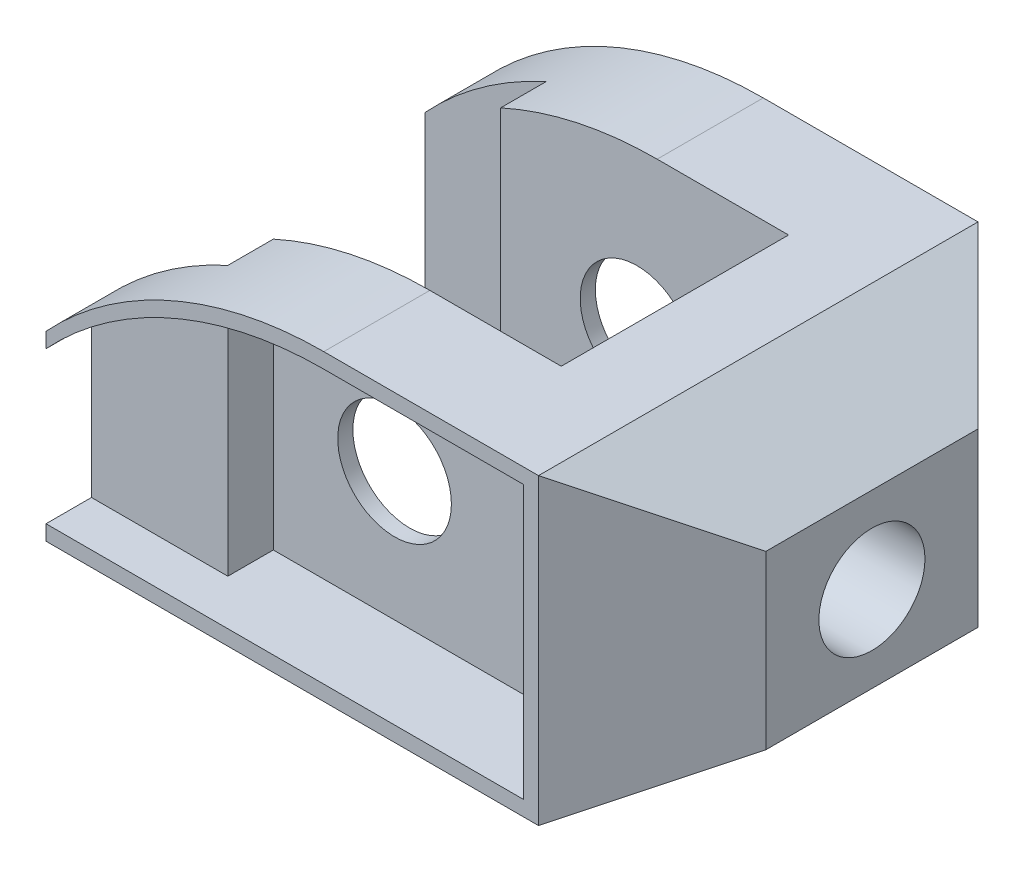
ISO-10303-21;
HEADER;
FILE_DESCRIPTION(('STEP AP214'),'2;1');
FILE_NAME('part.step','',(''),(''),'','','');
FILE_SCHEMA(('AUTOMOTIVE_DESIGN { 1 0 10303 214 1 1 1 1 }'));
ENDSEC;
DATA;
#1=APPLICATION_CONTEXT('core data for automotive mechanical design processes');
#2=APPLICATION_PROTOCOL_DEFINITION('international standard','automotive_design',2000,#1);
#3=PRODUCT_CONTEXT('',#1,'mechanical');
#4=PRODUCT('Part','Part','',(#3));
#5=PRODUCT_RELATED_PRODUCT_CATEGORY('part','',(#4));
#6=PRODUCT_DEFINITION_FORMATION('','',#4);
#7=PRODUCT_DEFINITION_CONTEXT('part definition',#1,'design');
#8=PRODUCT_DEFINITION('design','',#6,#7);
#9=PRODUCT_DEFINITION_SHAPE('','',#8);
#10=(LENGTH_UNIT() NAMED_UNIT(*) SI_UNIT(.MILLI.,.METRE.));
#11=(NAMED_UNIT(*) PLANE_ANGLE_UNIT() SI_UNIT($,.RADIAN.));
#12=(NAMED_UNIT(*) SI_UNIT($,.STERADIAN.) SOLID_ANGLE_UNIT());
#13=UNCERTAINTY_MEASURE_WITH_UNIT(LENGTH_MEASURE(1.E-05),#10,'distance_accuracy_value','');
#14=(GEOMETRIC_REPRESENTATION_CONTEXT(3) GLOBAL_UNCERTAINTY_ASSIGNED_CONTEXT((#13)) GLOBAL_UNIT_ASSIGNED_CONTEXT((#10,
#11,#12)) REPRESENTATION_CONTEXT('',''));
#15=CARTESIAN_POINT('',(0.,0.,0.));
#16=DIRECTION('',(0.,0.,1.));
#17=DIRECTION('',(1.,0.,0.));
#18=AXIS2_PLACEMENT_3D('',#15,#16,#17);
#19=CARTESIAN_POINT('',(-22.,0.,-17.));
#20=DIRECTION('',(-1.,0.,0.));
#21=DIRECTION('',(0.,0.,1.));
#22=AXIS2_PLACEMENT_3D('',#19,#20,#21);
#23=PLANE('',#22);
#24=DIRECTION('',(0.,-1.,0.));
#25=VECTOR('',#24,1.);
#26=CARTESIAN_POINT('',(-22.,34.3873021434453,-23.));
#27=LINE('',#26,#25);
#28=CARTESIAN_POINT('',(-22.,34.3873021434453,-23.));
#29=VERTEX_POINT('',#28);
#30=CARTESIAN_POINT('',(-22.,2.,-23.));
#31=VERTEX_POINT('',#30);
#32=EDGE_CURVE('E245',#29,#31,#27,.T.);
#33=ORIENTED_EDGE('',*,*,#32,.F.);
#34=DIRECTION('',(0.,0.,-1.));
#35=VECTOR('',#34,1.);
#36=CARTESIAN_POINT('',(-22.,34.3873021434453,-17.));
#37=LINE('',#36,#35);
#38=CARTESIAN_POINT('',(-22.,34.3873021434453,-17.));
#39=VERTEX_POINT('',#38);
#40=EDGE_CURVE('E256',#39,#29,#37,.T.);
#41=ORIENTED_EDGE('',*,*,#40,.F.);
#42=DIRECTION('',(0.,1.,0.));
#43=VECTOR('',#42,1.);
#44=CARTESIAN_POINT('',(-22.,0.,-17.));
#45=LINE('',#44,#43);
#46=CARTESIAN_POINT('',(-22.,2.,-17.));
#47=VERTEX_POINT('',#46);
#48=EDGE_CURVE('E970',#47,#39,#45,.T.);
#49=ORIENTED_EDGE('',*,*,#48,.F.);
#50=DIRECTION('',(0.,0.,-1.));
#51=VECTOR('',#50,1.);
#52=CARTESIAN_POINT('',(-22.,2.,-17.));
#53=LINE('',#52,#51);
#54=EDGE_CURVE('E258',#47,#31,#53,.T.);
#55=ORIENTED_EDGE('',*,*,#54,.T.);
#56=EDGE_LOOP('',(#33,#41,#49,#55));
#57=FACE_BOUND('',#56,.T.);
#58=ADVANCED_FACE('F43',(#57),#23,.F.);
#59=CARTESIAN_POINT('',(-5.99999999999999,19.,-66.));
#60=DIRECTION('',(0.,0.,1.));
#61=DIRECTION('',(1.,0.,0.));
#62=AXIS2_PLACEMENT_3D('',#59,#60,#61);
#63=CYLINDRICAL_SURFACE('',#62,7.5);
#64=CARTESIAN_POINT('',(-5.99999999999999,19.,-15.));
#65=DIRECTION('',(0.,0.,1.));
#66=DIRECTION('',(1.,0.,0.));
#67=AXIS2_PLACEMENT_3D('',#64,#65,#66);
#68=CIRCLE('',#67,7.5);
#69=CARTESIAN_POINT('',(1.50000000000001,19.,-15.));
#70=VERTEX_POINT('',#69);
#71=EDGE_CURVE('E373',#70,#70,#68,.F.);
#72=ORIENTED_EDGE('',*,*,#71,.F.);
#73=EDGE_LOOP('',(#72));
#74=FACE_BOUND('',#73,.T.);
#75=CARTESIAN_POINT('',(-5.99999999999999,19.,-17.));
#76=DIRECTION('',(0.,0.,-1.));
#77=DIRECTION('',(-1.,0.,0.));
#78=AXIS2_PLACEMENT_3D('',#75,#76,#77);
#79=CIRCLE('',#78,7.5);
#80=CARTESIAN_POINT('',(-13.5,19.,-17.));
#81=VERTEX_POINT('',#80);
#82=EDGE_CURVE('E969',#81,#81,#79,.F.);
#83=ORIENTED_EDGE('',*,*,#82,.F.);
#84=EDGE_LOOP('',(#83));
#85=FACE_BOUND('',#84,.T.);
#86=ADVANCED_FACE('F544',(#74,#85),#63,.F.);
#87=CARTESIAN_POINT('',(-22.,0.,17.));
#88=DIRECTION('',(1.,0.,0.));
#89=DIRECTION('',(0.,0.,-1.));
#90=AXIS2_PLACEMENT_3D('',#87,#88,#89);
#91=PLANE('',#90);
#92=DIRECTION('',(0.,0.,1.));
#93=VECTOR('',#92,1.);
#94=CARTESIAN_POINT('',(-22.,34.3873021434453,17.));
#95=LINE('',#94,#93);
#96=CARTESIAN_POINT('',(-22.,34.3873021434453,17.));
#97=VERTEX_POINT('',#96);
#98=CARTESIAN_POINT('',(-22.,34.3873021434453,23.));
#99=VERTEX_POINT('',#98);
#100=EDGE_CURVE('E326',#97,#99,#95,.T.);
#101=ORIENTED_EDGE('',*,*,#100,.T.);
#102=DIRECTION('',(0.,1.,0.));
#103=VECTOR('',#102,1.);
#104=CARTESIAN_POINT('',(-22.,34.3873021434453,23.));
#105=LINE('',#104,#103);
#106=CARTESIAN_POINT('',(-22.,1.99999999999999,23.));
#107=VERTEX_POINT('',#106);
#108=EDGE_CURVE('E59',#107,#99,#105,.T.);
#109=ORIENTED_EDGE('',*,*,#108,.F.);
#110=DIRECTION('',(0.,0.,1.));
#111=VECTOR('',#110,1.);
#112=CARTESIAN_POINT('',(-22.,1.99999999999999,17.));
#113=LINE('',#112,#111);
#114=CARTESIAN_POINT('',(-22.,1.99999999999999,17.));
#115=VERTEX_POINT('',#114);
#116=EDGE_CURVE('E323',#115,#107,#113,.T.);
#117=ORIENTED_EDGE('',*,*,#116,.F.);
#118=DIRECTION('',(0.,1.,0.));
#119=VECTOR('',#118,1.);
#120=CARTESIAN_POINT('',(-22.,0.,17.));
#121=LINE('',#120,#119);
#122=EDGE_CURVE('E301',#115,#97,#121,.T.);
#123=ORIENTED_EDGE('',*,*,#122,.T.);
#124=EDGE_LOOP('',(#101,#109,#117,#123));
#125=FACE_BOUND('',#124,.T.);
#126=ADVANCED_FACE('F551',(#125),#91,.T.);
#127=CARTESIAN_POINT('',(-5.99999999999999,19.,15.));
#128=DIRECTION('',(0.,0.,-1.));
#129=DIRECTION('',(-1.,0.,0.));
#130=AXIS2_PLACEMENT_3D('',#127,#128,#129);
#131=CIRCLE('',#130,7.5);
#132=CARTESIAN_POINT('',(-13.5,19.,15.));
#133=VERTEX_POINT('',#132);
#134=EDGE_CURVE('E387',#133,#133,#131,.F.);
#135=ORIENTED_EDGE('',*,*,#134,.F.);
#136=EDGE_LOOP('',(#135));
#137=FACE_BOUND('',#136,.T.);
#138=CARTESIAN_POINT('',(-5.99999999999999,19.,17.));
#139=DIRECTION('',(0.,0.,1.));
#140=DIRECTION('',(1.,0.,0.));
#141=AXIS2_PLACEMENT_3D('',#138,#139,#140);
#142=CIRCLE('',#141,7.5);
#143=CARTESIAN_POINT('',(1.50000000000001,19.,17.));
#144=VERTEX_POINT('',#143);
#145=EDGE_CURVE('E291',#144,#144,#142,.F.);
#146=ORIENTED_EDGE('',*,*,#145,.F.);
#147=EDGE_LOOP('',(#146));
#148=FACE_BOUND('',#147,.T.);
#149=ADVANCED_FACE('F554',(#137,#148),#63,.F.);
#150=CARTESIAN_POINT('',(-40.,40.,-29.));
#151=DIRECTION('',(1.,0.,0.));
#152=DIRECTION('',(0.,0.,-1.));
#153=AXIS2_PLACEMENT_3D('',#150,#151,#152);
#154=PLANE('',#153);
#155=DIRECTION('',(0.,-1.,0.));
#156=VECTOR('',#155,1.);
#157=CARTESIAN_POINT('',(-40.,1.99999999999999,23.));
#158=LINE('',#157,#156);
#159=CARTESIAN_POINT('',(-40.,22.,23.));
#160=VERTEX_POINT('',#159);
#161=CARTESIAN_POINT('',(-40.,1.99999999999999,23.));
#162=VERTEX_POINT('',#161);
#163=EDGE_CURVE('E279',#160,#162,#158,.T.);
#164=ORIENTED_EDGE('',*,*,#163,.F.);
#165=DIRECTION('',(0.,0.,1.));
#166=VECTOR('',#165,1.);
#167=CARTESIAN_POINT('',(-40.,22.,23.));
#168=LINE('',#167,#166);
#169=CARTESIAN_POINT('',(-40.,22.,29.));
#170=VERTEX_POINT('',#169);
#171=EDGE_CURVE('E285',#160,#170,#168,.T.);
#172=ORIENTED_EDGE('',*,*,#171,.T.);
#173=DIRECTION('',(0.,-1.,0.));
#174=VECTOR('',#173,1.);
#175=CARTESIAN_POINT('',(-40.,40.,29.));
#176=LINE('',#175,#174);
#177=CARTESIAN_POINT('',(-40.,24.,29.));
#178=VERTEX_POINT('',#177);
#179=EDGE_CURVE('E430',#178,#170,#176,.T.);
#180=ORIENTED_EDGE('',*,*,#179,.F.);
#181=DIRECTION('',(0.,0.,1.));
#182=VECTOR('',#181,1.);
#183=CARTESIAN_POINT('',(-40.,24.,-66.));
#184=LINE('',#183,#182);
#185=CARTESIAN_POINT('',(-40.,24.,21.));
#186=VERTEX_POINT('',#185);
#187=EDGE_CURVE('E401',#186,#178,#184,.T.);
#188=ORIENTED_EDGE('',*,*,#187,.F.);
#189=DIRECTION('',(0.,1.,0.));
#190=VECTOR('',#189,1.);
#191=CARTESIAN_POINT('',(-40.,-55.,21.));
#192=LINE('',#191,#190);
#193=CARTESIAN_POINT('',(-40.,0.,21.));
#194=VERTEX_POINT('',#193);
#195=EDGE_CURVE('E342',#194,#186,#192,.T.);
#196=ORIENTED_EDGE('',*,*,#195,.F.);
#197=DIRECTION('',(0.,0.,1.));
#198=VECTOR('',#197,1.);
#199=CARTESIAN_POINT('',(-40.,0.,-29.));
#200=LINE('',#199,#198);
#201=CARTESIAN_POINT('',(-40.,0.,29.));
#202=VERTEX_POINT('',#201);
#203=EDGE_CURVE('E424',#194,#202,#200,.T.);
#204=ORIENTED_EDGE('',*,*,#203,.T.);
#205=CARTESIAN_POINT('',(-40.,1.99999999999999,29.));
#206=VERTEX_POINT('',#205);
#207=EDGE_CURVE('E421',#206,#202,#176,.T.);
#208=ORIENTED_EDGE('',*,*,#207,.F.);
#209=DIRECTION('',(0.,0.,1.));
#210=VECTOR('',#209,1.);
#211=CARTESIAN_POINT('',(-40.,1.99999999999999,23.));
#212=LINE('',#211,#210);
#213=EDGE_CURVE('E286',#162,#206,#212,.T.);
#214=ORIENTED_EDGE('',*,*,#213,.F.);
#215=EDGE_LOOP('',(#164,#172,#180,#188,#196,#204,#208,#214));
#216=FACE_BOUND('',#215,.T.);
#217=ADVANCED_FACE('F625',(#216),#154,.F.);
#218=DIRECTION('',(0.,-1.,0.));
#219=VECTOR('',#218,1.);
#220=CARTESIAN_POINT('',(-40.,40.,-29.));
#221=LINE('',#220,#219);
#222=CARTESIAN_POINT('',(-40.,24.,-29.));
#223=VERTEX_POINT('',#222);
#224=CARTESIAN_POINT('',(-40.,22.,-29.));
#225=VERTEX_POINT('',#224);
#226=EDGE_CURVE('E434',#223,#225,#221,.T.);
#227=ORIENTED_EDGE('',*,*,#226,.T.);
#228=DIRECTION('',(0.,0.,-1.));
#229=VECTOR('',#228,1.);
#230=CARTESIAN_POINT('',(-40.,22.,-23.));
#231=LINE('',#230,#229);
#232=CARTESIAN_POINT('',(-40.,22.,-23.));
#233=VERTEX_POINT('',#232);
#234=EDGE_CURVE('E986',#233,#225,#231,.T.);
#235=ORIENTED_EDGE('',*,*,#234,.F.);
#236=DIRECTION('',(0.,1.,0.));
#237=VECTOR('',#236,1.);
#238=CARTESIAN_POINT('',(-40.,2.,-23.));
#239=LINE('',#238,#237);
#240=CARTESIAN_POINT('',(-40.,2.,-23.));
#241=VERTEX_POINT('',#240);
#242=EDGE_CURVE('E248',#241,#233,#239,.T.);
#243=ORIENTED_EDGE('',*,*,#242,.F.);
#244=DIRECTION('',(0.,0.,-1.));
#245=VECTOR('',#244,1.);
#246=CARTESIAN_POINT('',(-40.,2.,-23.));
#247=LINE('',#246,#245);
#248=CARTESIAN_POINT('',(-40.,2.,-29.));
#249=VERTEX_POINT('',#248);
#250=EDGE_CURVE('E999',#241,#249,#247,.T.);
#251=ORIENTED_EDGE('',*,*,#250,.T.);
#252=CARTESIAN_POINT('',(-40.,0.,-29.));
#253=VERTEX_POINT('',#252);
#254=EDGE_CURVE('E433',#249,#253,#221,.T.);
#255=ORIENTED_EDGE('',*,*,#254,.T.);
#256=CARTESIAN_POINT('',(-40.,0.,-21.));
#257=VERTEX_POINT('',#256);
#258=EDGE_CURVE('E425',#253,#257,#200,.T.);
#259=ORIENTED_EDGE('',*,*,#258,.T.);
#260=DIRECTION('',(0.,1.,0.));
#261=VECTOR('',#260,1.);
#262=CARTESIAN_POINT('',(-40.,-55.,-21.));
#263=LINE('',#262,#261);
#264=CARTESIAN_POINT('',(-40.,24.,-21.));
#265=VERTEX_POINT('',#264);
#266=EDGE_CURVE('E332',#257,#265,#263,.T.);
#267=ORIENTED_EDGE('',*,*,#266,.T.);
#268=EDGE_CURVE('E402',#223,#265,#184,.T.);
#269=ORIENTED_EDGE('',*,*,#268,.F.);
#270=EDGE_LOOP('',(#227,#235,#243,#251,#255,#259,#267,#269));
#271=FACE_BOUND('',#270,.T.);
#272=ADVANCED_FACE('F469',(#271),#154,.F.);
#273=CARTESIAN_POINT('',(-40.,40.,29.));
#274=DIRECTION('',(0.,0.,-1.));
#275=DIRECTION('',(-1.,0.,0.));
#276=AXIS2_PLACEMENT_3D('',#273,#274,#275);
#277=PLANE('',#276);
#278=ORIENTED_EDGE('',*,*,#179,.T.);
#279=CARTESIAN_POINT('',(-3.33939444035327,-12.,29.));
#280=DIRECTION('',(0.,0.,1.));
#281=DIRECTION('',(1.,0.,0.));
#282=AXIS2_PLACEMENT_3D('',#279,#280,#281);
#283=CIRCLE('',#282,50.);
#284=CARTESIAN_POINT('',(-3.33939399999999,38.,29.));
#285=VERTEX_POINT('',#284);
#286=EDGE_CURVE('E311',#285,#170,#283,.T.);
#287=ORIENTED_EDGE('',*,*,#286,.F.);
#288=DIRECTION('',(-1.,0.,0.));
#289=VECTOR('',#288,1.);
#290=CARTESIAN_POINT('',(0.,38.,29.));
#291=LINE('',#290,#289);
#292=CARTESIAN_POINT('',(23.,38.,29.));
#293=VERTEX_POINT('',#292);
#294=EDGE_CURVE('E67',#293,#285,#291,.T.);
#295=ORIENTED_EDGE('',*,*,#294,.F.);
#296=DIRECTION('',(0.,-1.,0.));
#297=VECTOR('',#296,1.);
#298=CARTESIAN_POINT('',(23.,0.,29.));
#299=LINE('',#298,#297);
#300=CARTESIAN_POINT('',(23.,2.,29.));
#301=VERTEX_POINT('',#300);
#302=EDGE_CURVE('E295',#293,#301,#299,.T.);
#303=ORIENTED_EDGE('',*,*,#302,.T.);
#304=DIRECTION('',(-1.,0.,0.));
#305=VECTOR('',#304,1.);
#306=CARTESIAN_POINT('',(0.,2.,29.));
#307=LINE('',#306,#305);
#308=EDGE_CURVE('E313',#301,#206,#307,.T.);
#309=ORIENTED_EDGE('',*,*,#308,.T.);
#310=ORIENTED_EDGE('',*,*,#207,.T.);
#311=DIRECTION('',(1.,0.,0.));
#312=VECTOR('',#311,1.);
#313=CARTESIAN_POINT('',(-40.,0.,29.));
#314=LINE('',#313,#312);
#315=CARTESIAN_POINT('',(25.,0.,29.));
#316=VERTEX_POINT('',#315);
#317=EDGE_CURVE('E418',#202,#316,#314,.T.);
#318=ORIENTED_EDGE('',*,*,#317,.T.);
#319=DIRECTION('',(0.,1.,0.));
#320=VECTOR('',#319,1.);
#321=CARTESIAN_POINT('',(25.,-55.,29.));
#322=LINE('',#321,#320);
#323=CARTESIAN_POINT('',(25.,40.,29.));
#324=VERTEX_POINT('',#323);
#325=EDGE_CURVE('E379',#316,#324,#322,.T.);
#326=ORIENTED_EDGE('',*,*,#325,.T.);
#327=DIRECTION('',(1.,0.,0.));
#328=VECTOR('',#327,1.);
#329=CARTESIAN_POINT('',(-40.,40.,29.));
#330=LINE('',#329,#328);
#331=CARTESIAN_POINT('',(-3.33939444035328,40.,29.));
#332=VERTEX_POINT('',#331);
#333=EDGE_CURVE('E417',#332,#324,#330,.T.);
#334=ORIENTED_EDGE('',*,*,#333,.F.);
#335=CARTESIAN_POINT('',(-3.33939444035327,-10.,29.));
#336=DIRECTION('',(0.,0.,1.));
#337=DIRECTION('',(1.,0.,0.));
#338=AXIS2_PLACEMENT_3D('',#335,#336,#337);
#339=CIRCLE('',#338,50.);
#340=EDGE_CURVE('E398',#332,#178,#339,.T.);
#341=ORIENTED_EDGE('',*,*,#340,.T.);
#342=EDGE_LOOP('',(#278,#287,#295,#303,#309,#310,#318,#326,#334,#341));
#343=FACE_BOUND('',#342,.T.);
#344=ADVANCED_FACE('F530',(#343),#277,.F.);
#345=CARTESIAN_POINT('',(0.,40.,0.));
#346=DIRECTION('',(0.,1.,0.));
#347=DIRECTION('',(0.,0.,1.));
#348=AXIS2_PLACEMENT_3D('',#345,#346,#347);
#349=PLANE('',#348);
#350=DIRECTION('',(0.,0.,1.));
#351=VECTOR('',#350,1.);
#352=CARTESIAN_POINT('',(14.,40.,0.));
#353=LINE('',#352,#351);
#354=CARTESIAN_POINT('',(14.,40.,-15.));
#355=VERTEX_POINT('',#354);
#356=CARTESIAN_POINT('',(14.,40.,15.));
#357=VERTEX_POINT('',#356);
#358=EDGE_CURVE('E360',#355,#357,#353,.T.);
#359=ORIENTED_EDGE('',*,*,#358,.T.);
#360=DIRECTION('',(-1.,0.,0.));
#361=VECTOR('',#360,1.);
#362=CARTESIAN_POINT('',(0.,40.,15.));
#363=LINE('',#362,#361);
#364=CARTESIAN_POINT('',(-3.33939444035327,40.,15.));
#365=VERTEX_POINT('',#364);
#366=EDGE_CURVE('E367',#357,#365,#363,.T.);
#367=ORIENTED_EDGE('',*,*,#366,.T.);
#368=DIRECTION('',(0.,0.,1.));
#369=VECTOR('',#368,1.);
#370=CARTESIAN_POINT('',(-3.33939444035327,40.,-66.));
#371=LINE('',#370,#369);
#372=EDGE_CURVE('E443',#365,#332,#371,.T.);
#373=ORIENTED_EDGE('',*,*,#372,.T.);
#374=ORIENTED_EDGE('',*,*,#333,.T.);
#375=DIRECTION('',(0.,0.,1.));
#376=VECTOR('',#375,1.);
#377=CARTESIAN_POINT('',(25.,40.,0.));
#378=LINE('',#377,#376);
#379=CARTESIAN_POINT('',(25.,40.,-29.));
#380=VERTEX_POINT('',#379);
#381=EDGE_CURVE('E440',#380,#324,#378,.T.);
#382=ORIENTED_EDGE('',*,*,#381,.F.);
#383=DIRECTION('',(-1.,0.,0.));
#384=VECTOR('',#383,1.);
#385=CARTESIAN_POINT('',(-40.,40.,-29.));
#386=LINE('',#385,#384);
#387=CARTESIAN_POINT('',(-3.33939444035328,40.,-29.));
#388=VERTEX_POINT('',#387);
#389=EDGE_CURVE('E414',#380,#388,#386,.T.);
#390=ORIENTED_EDGE('',*,*,#389,.T.);
#391=CARTESIAN_POINT('',(-3.33939444035327,40.,-15.));
#392=VERTEX_POINT('',#391);
#393=EDGE_CURVE('E444',#388,#392,#371,.T.);
#394=ORIENTED_EDGE('',*,*,#393,.T.);
#395=DIRECTION('',(1.,0.,0.));
#396=VECTOR('',#395,1.);
#397=CARTESIAN_POINT('',(0.,40.,-15.));
#398=LINE('',#397,#396);
#399=EDGE_CURVE('E363',#392,#355,#398,.T.);
#400=ORIENTED_EDGE('',*,*,#399,.T.);
#401=EDGE_LOOP('',(#359,#367,#373,#374,#382,#390,#394,#400));
#402=FACE_BOUND('',#401,.T.);
#403=ADVANCED_FACE('F480',(#402),#349,.T.);
#404=CARTESIAN_POINT('',(40.,40.,-29.));
#405=DIRECTION('',(-1.,0.,0.));
#406=DIRECTION('',(0.,0.,1.));
#407=AXIS2_PLACEMENT_3D('',#404,#405,#406);
#408=PLANE('',#407);
#409=CARTESIAN_POINT('',(40.,20.,0.));
#410=DIRECTION('',(1.,0.,0.));
#411=DIRECTION('',(0.,0.,-1.));
#412=AXIS2_PLACEMENT_3D('',#409,#410,#411);
#413=CIRCLE('',#412,7.);
#414=CARTESIAN_POINT('',(40.,20.,-6.99999999999999));
#415=VERTEX_POINT('',#414);
#416=EDGE_CURVE('E319',#415,#415,#413,.T.);
#417=ORIENTED_EDGE('',*,*,#416,.F.);
#418=EDGE_LOOP('',(#417));
#419=FACE_BOUND('',#418,.T.);
#420=DIRECTION('',(0.,0.,1.));
#421=VECTOR('',#420,1.);
#422=CARTESIAN_POINT('',(40.,8.66025403784427,-66.));
#423=LINE('',#422,#421);
#424=CARTESIAN_POINT('',(40.,8.66025403784426,-14.0000000000002));
#425=VERTEX_POINT('',#424);
#426=CARTESIAN_POINT('',(40.,8.66025403784427,14.0000000000002));
#427=VERTEX_POINT('',#426);
#428=EDGE_CURVE('E407',#425,#427,#423,.T.);
#429=ORIENTED_EDGE('',*,*,#428,.F.);
#430=DIRECTION('',(0.,1.,0.));
#431=VECTOR('',#430,1.);
#432=CARTESIAN_POINT('',(40.,-55.,-14.0000000000002));
#433=LINE('',#432,#431);
#434=CARTESIAN_POINT('',(40.,31.3397459621557,-14.0000000000002));
#435=VERTEX_POINT('',#434);
#436=EDGE_CURVE('E364',#425,#435,#433,.T.);
#437=ORIENTED_EDGE('',*,*,#436,.T.);
#438=DIRECTION('',(0.,0.,1.));
#439=VECTOR('',#438,1.);
#440=CARTESIAN_POINT('',(40.,31.3397459621557,-66.));
#441=LINE('',#440,#439);
#442=CARTESIAN_POINT('',(40.,31.3397459621557,14.0000000000002));
#443=VERTEX_POINT('',#442);
#444=EDGE_CURVE('E408',#435,#443,#441,.T.);
#445=ORIENTED_EDGE('',*,*,#444,.T.);
#446=DIRECTION('',(0.,1.,0.));
#447=VECTOR('',#446,1.);
#448=CARTESIAN_POINT('',(40.,-55.,14.0000000000002));
#449=LINE('',#448,#447);
#450=EDGE_CURVE('E359',#427,#443,#449,.T.);
#451=ORIENTED_EDGE('',*,*,#450,.F.);
#452=EDGE_LOOP('',(#429,#437,#445,#451));
#453=FACE_BOUND('',#452,.T.);
#454=ADVANCED_FACE('F45',(#419,#453),#408,.F.);
#455=CARTESIAN_POINT('',(0.,0.,0.));
#456=DIRECTION('',(0.,1.,0.));
#457=DIRECTION('',(0.,0.,1.));
#458=AXIS2_PLACEMENT_3D('',#455,#456,#457);
#459=PLANE('',#458);
#460=DIRECTION('',(0.,0.,-1.));
#461=VECTOR('',#460,1.);
#462=CARTESIAN_POINT('',(-24.,0.,0.));
#463=LINE('',#462,#461);
#464=CARTESIAN_POINT('',(-24.,0.,-15.));
#465=VERTEX_POINT('',#464);
#466=CARTESIAN_POINT('',(-24.,0.,-21.));
#467=VERTEX_POINT('',#466);
#468=EDGE_CURVE('E345',#465,#467,#463,.T.);
#469=ORIENTED_EDGE('',*,*,#468,.T.);
#470=DIRECTION('',(-1.,0.,0.));
#471=VECTOR('',#470,1.);
#472=CARTESIAN_POINT('',(0.,0.,-21.));
#473=LINE('',#472,#471);
#474=EDGE_CURVE('E353',#467,#257,#473,.T.);
#475=ORIENTED_EDGE('',*,*,#474,.T.);
#476=ORIENTED_EDGE('',*,*,#258,.F.);
#477=DIRECTION('',(-1.,0.,0.));
#478=VECTOR('',#477,1.);
#479=CARTESIAN_POINT('',(-40.,0.,-29.));
#480=LINE('',#479,#478);
#481=CARTESIAN_POINT('',(25.,0.,-29.));
#482=VERTEX_POINT('',#481);
#483=EDGE_CURVE('E411',#482,#253,#480,.T.);
#484=ORIENTED_EDGE('',*,*,#483,.F.);
#485=DIRECTION('',(0.,0.,1.));
#486=VECTOR('',#485,1.);
#487=CARTESIAN_POINT('',(25.,0.,0.));
#488=LINE('',#487,#486);
#489=EDGE_CURVE('E437',#482,#316,#488,.T.);
#490=ORIENTED_EDGE('',*,*,#489,.T.);
#491=ORIENTED_EDGE('',*,*,#317,.F.);
#492=ORIENTED_EDGE('',*,*,#203,.F.);
#493=DIRECTION('',(1.,0.,0.));
#494=VECTOR('',#493,1.);
#495=CARTESIAN_POINT('',(0.,0.,21.));
#496=LINE('',#495,#494);
#497=CARTESIAN_POINT('',(-24.,0.,21.));
#498=VERTEX_POINT('',#497);
#499=EDGE_CURVE('E356',#194,#498,#496,.T.);
#500=ORIENTED_EDGE('',*,*,#499,.T.);
#501=CARTESIAN_POINT('',(-24.,0.,15.));
#502=VERTEX_POINT('',#501);
#503=EDGE_CURVE('E349',#498,#502,#463,.T.);
#504=ORIENTED_EDGE('',*,*,#503,.T.);
#505=DIRECTION('',(-1.,0.,0.));
#506=VECTOR('',#505,1.);
#507=CARTESIAN_POINT('',(0.,0.,15.));
#508=LINE('',#507,#506);
#509=CARTESIAN_POINT('',(14.,0.,15.));
#510=VERTEX_POINT('',#509);
#511=EDGE_CURVE('E390',#510,#502,#508,.T.);
#512=ORIENTED_EDGE('',*,*,#511,.F.);
#513=DIRECTION('',(0.,0.,1.));
#514=VECTOR('',#513,1.);
#515=CARTESIAN_POINT('',(14.,0.,0.));
#516=LINE('',#515,#514);
#517=CARTESIAN_POINT('',(14.,0.,-15.));
#518=VERTEX_POINT('',#517);
#519=EDGE_CURVE('E457',#518,#510,#516,.T.);
#520=ORIENTED_EDGE('',*,*,#519,.F.);
#521=DIRECTION('',(1.,0.,0.));
#522=VECTOR('',#521,1.);
#523=CARTESIAN_POINT('',(0.,0.,-15.));
#524=LINE('',#523,#522);
#525=EDGE_CURVE('E385',#465,#518,#524,.T.);
#526=ORIENTED_EDGE('',*,*,#525,.F.);
#527=EDGE_LOOP('',(#469,#475,#476,#484,#490,#491,#492,#500,#504,#512,#520,#526));
#528=FACE_BOUND('',#527,.T.);
#529=ADVANCED_FACE('F499',(#528),#459,.F.);
#530=CARTESIAN_POINT('',(40.,8.66025403784427,-66.));
#531=DIRECTION('',(-0.499999999999995,0.866025403784442,0.));
#532=DIRECTION('',(-0.866025403784442,-0.499999999999995,0.));
#533=AXIS2_PLACEMENT_3D('',#530,#531,#532);
#534=PLANE('',#533);
#535=ORIENTED_EDGE('',*,*,#489,.F.);
#536=DIRECTION('',(0.654653670707982,0.377964473009225,0.654653670707974));
#537=VECTOR('',#536,1.);
#538=CARTESIAN_POINT('',(17.7142857142857,-4.20640910409578,-36.2857142857142));
#539=LINE('',#538,#537);
#540=EDGE_CURVE('E395',#482,#425,#539,.T.);
#541=ORIENTED_EDGE('',*,*,#540,.T.);
#542=ORIENTED_EDGE('',*,*,#428,.T.);
#543=DIRECTION('',(0.654653670707981,0.377964473009224,-0.654653670707975));
#544=VECTOR('',#543,1.);
#545=CARTESIAN_POINT('',(74.2857142857145,28.4551204100598,-20.2857142857139));
#546=LINE('',#545,#544);
#547=EDGE_CURVE('E393',#316,#427,#546,.T.);
#548=ORIENTED_EDGE('',*,*,#547,.F.);
#549=EDGE_LOOP('',(#535,#541,#542,#548));
#550=FACE_BOUND('',#549,.T.);
#551=ADVANCED_FACE('F494',(#550),#534,.F.);
#552=CARTESIAN_POINT('',(40.,31.3397459621557,-66.));
#553=DIRECTION('',(-0.499999999999995,-0.866025403784442,0.));
#554=DIRECTION('',(0.866025403784442,-0.499999999999995,0.));
#555=AXIS2_PLACEMENT_3D('',#552,#553,#554);
#556=PLANE('',#555);
#557=ORIENTED_EDGE('',*,*,#444,.F.);
#558=DIRECTION('',(-0.654653670707982,0.377964473009225,-0.654653670707974));
#559=VECTOR('',#558,1.);
#560=CARTESIAN_POINT('',(17.7142857142857,44.2064091040958,-36.2857142857142));
#561=LINE('',#560,#559);
#562=EDGE_CURVE('E454',#435,#380,#561,.T.);
#563=ORIENTED_EDGE('',*,*,#562,.T.);
#564=ORIENTED_EDGE('',*,*,#381,.T.);
#565=DIRECTION('',(-0.654653670707981,0.377964473009225,0.654653670707975));
#566=VECTOR('',#565,1.);
#567=CARTESIAN_POINT('',(74.2857142857145,11.5448795899402,-20.2857142857139));
#568=LINE('',#567,#566);
#569=EDGE_CURVE('E452',#443,#324,#568,.T.);
#570=ORIENTED_EDGE('',*,*,#569,.F.);
#571=EDGE_LOOP('',(#557,#563,#564,#570));
#572=FACE_BOUND('',#571,.T.);
#573=ADVANCED_FACE('F485',(#572),#556,.F.);
#574=CARTESIAN_POINT('',(-3.33939444035327,-10.,-66.));
#575=DIRECTION('',(0.,0.,1.));
#576=DIRECTION('',(1.,0.,0.));
#577=AXIS2_PLACEMENT_3D('',#574,#575,#576);
#578=CYLINDRICAL_SURFACE('',#577,50.);
#579=DIRECTION('',(0.,0.,1.));
#580=VECTOR('',#579,1.);
#581=CARTESIAN_POINT('',(-24.,35.5317403347236,-66.));
#582=LINE('',#581,#580);
#583=CARTESIAN_POINT('',(-24.,35.5317403347236,21.));
#584=VERTEX_POINT('',#583);
#585=CARTESIAN_POINT('',(-24.,35.5317403347236,15.));
#586=VERTEX_POINT('',#585);
#587=EDGE_CURVE('E351',#584,#586,#582,.F.);
#588=ORIENTED_EDGE('',*,*,#587,.F.);
#589=CARTESIAN_POINT('',(-3.33939444035327,-10.,21.));
#590=DIRECTION('',(0.,0.,1.));
#591=DIRECTION('',(1.,0.,0.));
#592=AXIS2_PLACEMENT_3D('',#589,#590,#591);
#593=CIRCLE('',#592,50.);
#594=EDGE_CURVE('E11',#186,#584,#593,.F.);
#595=ORIENTED_EDGE('',*,*,#594,.F.);
#596=ORIENTED_EDGE('',*,*,#187,.T.);
#597=ORIENTED_EDGE('',*,*,#340,.F.);
#598=ORIENTED_EDGE('',*,*,#372,.F.);
#599=CARTESIAN_POINT('',(-3.33939444035327,-10.,15.));
#600=DIRECTION('',(0.,0.,-1.));
#601=DIRECTION('',(-1.,0.,0.));
#602=AXIS2_PLACEMENT_3D('',#599,#600,#601);
#603=CIRCLE('',#602,50.);
#604=EDGE_CURVE('E449',#365,#586,#603,.F.);
#605=ORIENTED_EDGE('',*,*,#604,.T.);
#606=EDGE_LOOP('',(#588,#595,#596,#597,#598,#605));
#607=FACE_BOUND('',#606,.T.);
#608=ADVANCED_FACE('F524',(#607),#578,.T.);
#609=CARTESIAN_POINT('',(-3.33939444035327,-10.,-21.));
#610=DIRECTION('',(0.,0.,-1.));
#611=DIRECTION('',(-1.,0.,0.));
#612=AXIS2_PLACEMENT_3D('',#609,#610,#611);
#613=CIRCLE('',#612,50.);
#614=CARTESIAN_POINT('',(-24.,35.5317403347236,-21.));
#615=VERTEX_POINT('',#614);
#616=EDGE_CURVE('E52',#615,#265,#613,.F.);
#617=ORIENTED_EDGE('',*,*,#616,.F.);
#618=DIRECTION('',(0.,0.,1.));
#619=VECTOR('',#618,1.);
#620=CARTESIAN_POINT('',(-24.,35.5317403347236,-66.));
#621=LINE('',#620,#619);
#622=CARTESIAN_POINT('',(-24.,35.5317403347236,-15.));
#623=VERTEX_POINT('',#622);
#624=EDGE_CURVE('E335',#623,#615,#621,.F.);
#625=ORIENTED_EDGE('',*,*,#624,.F.);
#626=CARTESIAN_POINT('',(-3.33939444035327,-10.,-15.));
#627=DIRECTION('',(0.,0.,1.));
#628=DIRECTION('',(1.,0.,0.));
#629=AXIS2_PLACEMENT_3D('',#626,#627,#628);
#630=CIRCLE('',#629,50.);
#631=EDGE_CURVE('E447',#623,#392,#630,.F.);
#632=ORIENTED_EDGE('',*,*,#631,.T.);
#633=ORIENTED_EDGE('',*,*,#393,.F.);
#634=CARTESIAN_POINT('',(-3.33939444035327,-10.,-29.));
#635=DIRECTION('',(0.,0.,1.));
#636=DIRECTION('',(1.,0.,0.));
#637=AXIS2_PLACEMENT_3D('',#634,#635,#636);
#638=CIRCLE('',#637,50.);
#639=EDGE_CURVE('E405',#388,#223,#638,.T.);
#640=ORIENTED_EDGE('',*,*,#639,.T.);
#641=ORIENTED_EDGE('',*,*,#268,.T.);
#642=EDGE_LOOP('',(#617,#625,#632,#633,#640,#641));
#643=FACE_BOUND('',#642,.T.);
#644=ADVANCED_FACE('F472',(#643),#578,.T.);
#645=CARTESIAN_POINT('',(-40.,40.,-29.));
#646=DIRECTION('',(0.,0.,1.));
#647=DIRECTION('',(1.,0.,0.));
#648=AXIS2_PLACEMENT_3D('',#645,#646,#647);
#649=PLANE('',#648);
#650=CARTESIAN_POINT('',(-3.33939444035327,-12.,-29.));
#651=DIRECTION('',(0.,0.,-1.));
#652=DIRECTION('',(-1.,0.,0.));
#653=AXIS2_PLACEMENT_3D('',#650,#651,#652);
#654=CIRCLE('',#653,50.);
#655=CARTESIAN_POINT('',(-3.33939399999999,38.,-29.));
#656=VERTEX_POINT('',#655);
#657=EDGE_CURVE('E983',#225,#656,#654,.T.);
#658=ORIENTED_EDGE('',*,*,#657,.F.);
#659=ORIENTED_EDGE('',*,*,#226,.F.);
#660=ORIENTED_EDGE('',*,*,#639,.F.);
#661=ORIENTED_EDGE('',*,*,#389,.F.);
#662=DIRECTION('',(0.,1.,0.));
#663=VECTOR('',#662,1.);
#664=CARTESIAN_POINT('',(25.,-55.,-29.));
#665=LINE('',#664,#663);
#666=EDGE_CURVE('E377',#482,#380,#665,.T.);
#667=ORIENTED_EDGE('',*,*,#666,.F.);
#668=ORIENTED_EDGE('',*,*,#483,.T.);
#669=ORIENTED_EDGE('',*,*,#254,.F.);
#670=DIRECTION('',(-1.,0.,0.));
#671=VECTOR('',#670,1.);
#672=CARTESIAN_POINT('',(0.,2.,-29.));
#673=LINE('',#672,#671);
#674=CARTESIAN_POINT('',(23.,2.,-29.));
#675=VERTEX_POINT('',#674);
#676=EDGE_CURVE('E977',#675,#249,#673,.T.);
#677=ORIENTED_EDGE('',*,*,#676,.F.);
#678=DIRECTION('',(0.,-1.,0.));
#679=VECTOR('',#678,1.);
#680=CARTESIAN_POINT('',(23.,0.,-29.));
#681=LINE('',#680,#679);
#682=CARTESIAN_POINT('',(23.,38.,-29.));
#683=VERTEX_POINT('',#682);
#684=EDGE_CURVE('E989',#683,#675,#681,.T.);
#685=ORIENTED_EDGE('',*,*,#684,.F.);
#686=DIRECTION('',(-1.,0.,0.));
#687=VECTOR('',#686,1.);
#688=CARTESIAN_POINT('',(0.,38.,-29.));
#689=LINE('',#688,#687);
#690=EDGE_CURVE('E985',#683,#656,#689,.T.);
#691=ORIENTED_EDGE('',*,*,#690,.T.);
#692=EDGE_LOOP('',(#658,#659,#660,#661,#667,#668,#669,#677,#685,#691));
#693=FACE_BOUND('',#692,.T.);
#694=ADVANCED_FACE('F476',(#693),#649,.F.);
#695=CARTESIAN_POINT('',(14.,-55.,0.));
#696=DIRECTION('',(-1.,0.,0.));
#697=DIRECTION('',(0.,0.,1.));
#698=AXIS2_PLACEMENT_3D('',#695,#696,#697);
#699=PLANE('',#698);
#700=CARTESIAN_POINT('',(14.,20.,0.));
#701=DIRECTION('',(-1.,0.,0.));
#702=DIRECTION('',(0.,0.,1.));
#703=AXIS2_PLACEMENT_3D('',#700,#701,#702);
#704=CIRCLE('',#703,7.);
#705=CARTESIAN_POINT('',(14.,20.,7.00000000000002));
#706=VERTEX_POINT('',#705);
#707=EDGE_CURVE('E47',#706,#706,#704,.T.);
#708=ORIENTED_EDGE('',*,*,#707,.F.);
#709=EDGE_LOOP('',(#708));
#710=FACE_BOUND('',#709,.T.);
#711=ORIENTED_EDGE('',*,*,#519,.T.);
#712=DIRECTION('',(0.,1.,0.));
#713=VECTOR('',#712,1.);
#714=CARTESIAN_POINT('',(14.,-55.,15.));
#715=LINE('',#714,#713);
#716=EDGE_CURVE('E371',#510,#357,#715,.T.);
#717=ORIENTED_EDGE('',*,*,#716,.T.);
#718=ORIENTED_EDGE('',*,*,#358,.F.);
#719=DIRECTION('',(0.,1.,0.));
#720=VECTOR('',#719,1.);
#721=CARTESIAN_POINT('',(14.,-55.,-15.));
#722=LINE('',#721,#720);
#723=EDGE_CURVE('E370',#518,#355,#722,.T.);
#724=ORIENTED_EDGE('',*,*,#723,.F.);
#725=EDGE_LOOP('',(#711,#717,#718,#724));
#726=FACE_BOUND('',#725,.T.);
#727=ADVANCED_FACE('F514',(#710,#726),#699,.T.);
#728=CARTESIAN_POINT('',(0.,-55.,15.));
#729=DIRECTION('',(0.,0.,-1.));
#730=DIRECTION('',(-1.,0.,0.));
#731=AXIS2_PLACEMENT_3D('',#728,#729,#730);
#732=PLANE('',#731);
#733=DIRECTION('',(0.,-1.,0.));
#734=VECTOR('',#733,1.);
#735=CARTESIAN_POINT('',(-24.,-55.,15.));
#736=LINE('',#735,#734);
#737=EDGE_CURVE('E348',#586,#502,#736,.T.);
#738=ORIENTED_EDGE('',*,*,#737,.F.);
#739=ORIENTED_EDGE('',*,*,#604,.F.);
#740=ORIENTED_EDGE('',*,*,#366,.F.);
#741=ORIENTED_EDGE('',*,*,#716,.F.);
#742=ORIENTED_EDGE('',*,*,#511,.T.);
#743=EDGE_LOOP('',(#738,#739,#740,#741,#742));
#744=FACE_BOUND('',#743,.T.);
#745=ORIENTED_EDGE('',*,*,#134,.T.);
#746=EDGE_LOOP('',(#745));
#747=FACE_BOUND('',#746,.T.);
#748=ADVANCED_FACE('F520',(#744,#747),#732,.T.);
#749=CARTESIAN_POINT('',(0.,-55.,-15.));
#750=DIRECTION('',(0.,0.,1.));
#751=DIRECTION('',(1.,0.,0.));
#752=AXIS2_PLACEMENT_3D('',#749,#750,#751);
#753=PLANE('',#752);
#754=DIRECTION('',(0.,1.,0.));
#755=VECTOR('',#754,1.);
#756=CARTESIAN_POINT('',(-24.,-55.,-15.));
#757=LINE('',#756,#755);
#758=EDGE_CURVE('E459',#465,#623,#757,.T.);
#759=ORIENTED_EDGE('',*,*,#758,.F.);
#760=ORIENTED_EDGE('',*,*,#525,.T.);
#761=ORIENTED_EDGE('',*,*,#723,.T.);
#762=ORIENTED_EDGE('',*,*,#399,.F.);
#763=ORIENTED_EDGE('',*,*,#631,.F.);
#764=EDGE_LOOP('',(#759,#760,#761,#762,#763));
#765=FACE_BOUND('',#764,.T.);
#766=ORIENTED_EDGE('',*,*,#71,.T.);
#767=EDGE_LOOP('',(#766));
#768=FACE_BOUND('',#767,.T.);
#769=ADVANCED_FACE('F507',(#765,#768),#753,.T.);
#770=CARTESIAN_POINT('',(26.9999999999999,-55.,27.0000000000002));
#771=DIRECTION('',(0.707106781186544,0.,0.707106781186551));
#772=DIRECTION('',(0.707106781186551,0.,-0.707106781186544));
#773=AXIS2_PLACEMENT_3D('',#770,#771,#772);
#774=PLANE('',#773);
#775=ORIENTED_EDGE('',*,*,#547,.T.);
#776=ORIENTED_EDGE('',*,*,#450,.T.);
#777=ORIENTED_EDGE('',*,*,#569,.T.);
#778=ORIENTED_EDGE('',*,*,#325,.F.);
#779=EDGE_LOOP('',(#775,#776,#777,#778));
#780=FACE_BOUND('',#779,.T.);
#781=ADVANCED_FACE('F533',(#780),#774,.T.);
#782=CARTESIAN_POINT('',(26.9999999999999,-55.,-27.0000000000002));
#783=DIRECTION('',(-0.707106781186543,0.,0.707106781186552));
#784=DIRECTION('',(0.707106781186552,0.,0.707106781186543));
#785=AXIS2_PLACEMENT_3D('',#782,#783,#784);
#786=PLANE('',#785);
#787=ORIENTED_EDGE('',*,*,#666,.T.);
#788=ORIENTED_EDGE('',*,*,#562,.F.);
#789=ORIENTED_EDGE('',*,*,#436,.F.);
#790=ORIENTED_EDGE('',*,*,#540,.F.);
#791=EDGE_LOOP('',(#787,#788,#789,#790));
#792=FACE_BOUND('',#791,.T.);
#793=ADVANCED_FACE('F487',(#792),#786,.F.);
#794=CARTESIAN_POINT('',(-24.,-55.,-21.));
#795=DIRECTION('',(1.,0.,0.));
#796=DIRECTION('',(0.,0.,-1.));
#797=AXIS2_PLACEMENT_3D('',#794,#795,#796);
#798=PLANE('',#797);
#799=ORIENTED_EDGE('',*,*,#758,.T.);
#800=ORIENTED_EDGE('',*,*,#624,.T.);
#801=DIRECTION('',(0.,1.,0.));
#802=VECTOR('',#801,1.);
#803=CARTESIAN_POINT('',(-24.,-55.,-21.));
#804=LINE('',#803,#802);
#805=EDGE_CURVE('E336',#467,#615,#804,.T.);
#806=ORIENTED_EDGE('',*,*,#805,.F.);
#807=ORIENTED_EDGE('',*,*,#468,.F.);
#808=EDGE_LOOP('',(#799,#800,#806,#807));
#809=FACE_BOUND('',#808,.T.);
#810=ADVANCED_FACE('F502',(#809),#798,.F.);
#811=CARTESIAN_POINT('',(-40.,-55.,-21.));
#812=DIRECTION('',(0.,0.,-1.));
#813=DIRECTION('',(-1.,0.,0.));
#814=AXIS2_PLACEMENT_3D('',#811,#812,#813);
#815=PLANE('',#814);
#816=ORIENTED_EDGE('',*,*,#805,.T.);
#817=ORIENTED_EDGE('',*,*,#616,.T.);
#818=ORIENTED_EDGE('',*,*,#266,.F.);
#819=ORIENTED_EDGE('',*,*,#474,.F.);
#820=EDGE_LOOP('',(#816,#817,#818,#819));
#821=FACE_BOUND('',#820,.T.);
#822=ADVANCED_FACE('F463',(#821),#815,.F.);
#823=CARTESIAN_POINT('',(-24.,-55.,21.));
#824=DIRECTION('',(0.,0.,1.));
#825=DIRECTION('',(1.,0.,0.));
#826=AXIS2_PLACEMENT_3D('',#823,#824,#825);
#827=PLANE('',#826);
#828=ORIENTED_EDGE('',*,*,#195,.T.);
#829=ORIENTED_EDGE('',*,*,#594,.T.);
#830=DIRECTION('',(0.,1.,0.));
#831=VECTOR('',#830,1.);
#832=CARTESIAN_POINT('',(-24.,-55.,21.));
#833=LINE('',#832,#831);
#834=EDGE_CURVE('E339',#498,#584,#833,.T.);
#835=ORIENTED_EDGE('',*,*,#834,.F.);
#836=ORIENTED_EDGE('',*,*,#499,.F.);
#837=EDGE_LOOP('',(#828,#829,#835,#836));
#838=FACE_BOUND('',#837,.T.);
#839=ADVANCED_FACE('F590',(#838),#827,.F.);
#840=ORIENTED_EDGE('',*,*,#834,.T.);
#841=ORIENTED_EDGE('',*,*,#587,.T.);
#842=ORIENTED_EDGE('',*,*,#737,.T.);
#843=ORIENTED_EDGE('',*,*,#503,.F.);
#844=EDGE_LOOP('',(#840,#841,#842,#843));
#845=FACE_BOUND('',#844,.T.);
#846=ADVANCED_FACE('F586',(#845),#798,.F.);
#847=CARTESIAN_POINT('',(-55.,20.,0.));
#848=DIRECTION('',(1.,0.,0.));
#849=DIRECTION('',(0.,0.,-1.));
#850=AXIS2_PLACEMENT_3D('',#847,#848,#849);
#851=CYLINDRICAL_SURFACE('',#850,7.);
#852=ORIENTED_EDGE('',*,*,#707,.T.);
#853=EDGE_LOOP('',(#852));
#854=FACE_BOUND('',#853,.T.);
#855=ORIENTED_EDGE('',*,*,#416,.T.);
#856=EDGE_LOOP('',(#855));
#857=FACE_BOUND('',#856,.T.);
#858=ADVANCED_FACE('F583',(#854,#857),#851,.F.);
#859=CARTESIAN_POINT('',(0.,38.,17.));
#860=DIRECTION('',(0.,1.,0.));
#861=DIRECTION('',(-1.,0.,0.));
#862=AXIS2_PLACEMENT_3D('',#859,#860,#861);
#863=PLANE('',#862);
#864=ORIENTED_EDGE('',*,*,#294,.T.);
#865=DIRECTION('',(0.,0.,1.));
#866=VECTOR('',#865,1.);
#867=CARTESIAN_POINT('',(-3.33939399999999,38.,17.));
#868=LINE('',#867,#866);
#869=CARTESIAN_POINT('',(-3.33939399999999,38.,17.));
#870=VERTEX_POINT('',#869);
#871=EDGE_CURVE('E309',#870,#285,#868,.T.);
#872=ORIENTED_EDGE('',*,*,#871,.F.);
#873=DIRECTION('',(-1.,0.,0.));
#874=VECTOR('',#873,1.);
#875=CARTESIAN_POINT('',(0.,38.,17.));
#876=LINE('',#875,#874);
#877=CARTESIAN_POINT('',(23.,38.,17.));
#878=VERTEX_POINT('',#877);
#879=EDGE_CURVE('E294',#878,#870,#876,.T.);
#880=ORIENTED_EDGE('',*,*,#879,.F.);
#881=DIRECTION('',(0.,0.,1.));
#882=VECTOR('',#881,1.);
#883=CARTESIAN_POINT('',(23.,38.,17.));
#884=LINE('',#883,#882);
#885=EDGE_CURVE('E317',#878,#293,#884,.T.);
#886=ORIENTED_EDGE('',*,*,#885,.T.);
#887=EDGE_LOOP('',(#864,#872,#880,#886));
#888=FACE_BOUND('',#887,.T.);
#889=ADVANCED_FACE('F571',(#888),#863,.F.);
#890=CARTESIAN_POINT('',(23.,0.,17.));
#891=DIRECTION('',(-1.,0.,0.));
#892=DIRECTION('',(0.,-1.,0.));
#893=AXIS2_PLACEMENT_3D('',#890,#891,#892);
#894=PLANE('',#893);
#895=ORIENTED_EDGE('',*,*,#302,.F.);
#896=ORIENTED_EDGE('',*,*,#885,.F.);
#897=DIRECTION('',(0.,-1.,0.));
#898=VECTOR('',#897,1.);
#899=CARTESIAN_POINT('',(23.,0.,17.));
#900=LINE('',#899,#898);
#901=CARTESIAN_POINT('',(23.,2.,17.));
#902=VERTEX_POINT('',#901);
#903=EDGE_CURVE('E306',#878,#902,#900,.T.);
#904=ORIENTED_EDGE('',*,*,#903,.T.);
#905=DIRECTION('',(0.,0.,1.));
#906=VECTOR('',#905,1.);
#907=CARTESIAN_POINT('',(23.,2.,17.));
#908=LINE('',#907,#906);
#909=EDGE_CURVE('E320',#902,#301,#908,.T.);
#910=ORIENTED_EDGE('',*,*,#909,.T.);
#911=EDGE_LOOP('',(#895,#896,#904,#910));
#912=FACE_BOUND('',#911,.T.);
#913=ADVANCED_FACE('F567',(#912),#894,.T.);
#914=CARTESIAN_POINT('',(0.,2.,17.));
#915=DIRECTION('',(0.,1.,0.));
#916=DIRECTION('',(-1.,0.,0.));
#917=AXIS2_PLACEMENT_3D('',#914,#915,#916);
#918=PLANE('',#917);
#919=ORIENTED_EDGE('',*,*,#308,.F.);
#920=ORIENTED_EDGE('',*,*,#909,.F.);
#921=DIRECTION('',(-1.,0.,0.));
#922=VECTOR('',#921,1.);
#923=CARTESIAN_POINT('',(0.,2.,17.));
#924=LINE('',#923,#922);
#925=EDGE_CURVE('E303',#902,#115,#924,.T.);
#926=ORIENTED_EDGE('',*,*,#925,.T.);
#927=ORIENTED_EDGE('',*,*,#116,.T.);
#928=DIRECTION('',(1.,0.,0.));
#929=VECTOR('',#928,1.);
#930=CARTESIAN_POINT('',(-22.,1.99999999999999,23.));
#931=LINE('',#930,#929);
#932=EDGE_CURVE('E282',#162,#107,#931,.T.);
#933=ORIENTED_EDGE('',*,*,#932,.F.);
#934=ORIENTED_EDGE('',*,*,#213,.T.);
#935=EDGE_LOOP('',(#919,#920,#926,#927,#933,#934));
#936=FACE_BOUND('',#935,.T.);
#937=ADVANCED_FACE('F570',(#936),#918,.T.);
#938=CARTESIAN_POINT('',(-3.33939444035327,-12.,17.));
#939=DIRECTION('',(0.,0.,1.));
#940=DIRECTION('',(1.,0.,0.));
#941=AXIS2_PLACEMENT_3D('',#938,#939,#940);
#942=CYLINDRICAL_SURFACE('',#941,50.);
#943=ORIENTED_EDGE('',*,*,#286,.T.);
#944=ORIENTED_EDGE('',*,*,#171,.F.);
#945=CARTESIAN_POINT('',(-3.33939444035326,-12.,23.));
#946=DIRECTION('',(0.,0.,1.));
#947=DIRECTION('',(1.,0.,0.));
#948=AXIS2_PLACEMENT_3D('',#945,#946,#947);
#949=CIRCLE('',#948,50.);
#950=EDGE_CURVE('E277',#99,#160,#949,.T.);
#951=ORIENTED_EDGE('',*,*,#950,.F.);
#952=ORIENTED_EDGE('',*,*,#100,.F.);
#953=CARTESIAN_POINT('',(-3.33939444035327,-12.,17.));
#954=DIRECTION('',(0.,0.,1.));
#955=DIRECTION('',(1.,0.,0.));
#956=AXIS2_PLACEMENT_3D('',#953,#954,#955);
#957=CIRCLE('',#956,50.);
#958=EDGE_CURVE('E298',#870,#97,#957,.T.);
#959=ORIENTED_EDGE('',*,*,#958,.F.);
#960=ORIENTED_EDGE('',*,*,#871,.T.);
#961=EDGE_LOOP('',(#943,#944,#951,#952,#959,#960));
#962=FACE_BOUND('',#961,.T.);
#963=ADVANCED_FACE('F565',(#962),#942,.F.);
#964=CARTESIAN_POINT('',(0.,0.,17.));
#965=DIRECTION('',(0.,0.,1.));
#966=DIRECTION('',(1.,0.,0.));
#967=AXIS2_PLACEMENT_3D('',#964,#965,#966);
#968=PLANE('',#967);
#969=ORIENTED_EDGE('',*,*,#145,.T.);
#970=EDGE_LOOP('',(#969));
#971=FACE_BOUND('',#970,.T.);
#972=ORIENTED_EDGE('',*,*,#879,.T.);
#973=ORIENTED_EDGE('',*,*,#958,.T.);
#974=ORIENTED_EDGE('',*,*,#122,.F.);
#975=ORIENTED_EDGE('',*,*,#925,.F.);
#976=ORIENTED_EDGE('',*,*,#903,.F.);
#977=EDGE_LOOP('',(#972,#973,#974,#975,#976));
#978=FACE_BOUND('',#977,.T.);
#979=ADVANCED_FACE('F562',(#971,#978),#968,.T.);
#980=CARTESIAN_POINT('',(-3.33939444035326,-12.,23.));
#981=DIRECTION('',(0.,0.,1.));
#982=DIRECTION('',(1.,0.,0.));
#983=AXIS2_PLACEMENT_3D('',#980,#981,#982);
#984=PLANE('',#983);
#985=ORIENTED_EDGE('',*,*,#950,.T.);
#986=ORIENTED_EDGE('',*,*,#163,.T.);
#987=ORIENTED_EDGE('',*,*,#932,.T.);
#988=ORIENTED_EDGE('',*,*,#108,.T.);
#989=EDGE_LOOP('',(#985,#986,#987,#988));
#990=FACE_BOUND('',#989,.T.);
#991=ADVANCED_FACE('F558',(#990),#984,.T.);
#992=CARTESIAN_POINT('',(0.,2.,-17.));
#993=DIRECTION('',(0.,-1.,0.));
#994=DIRECTION('',(0.,0.,-1.));
#995=AXIS2_PLACEMENT_3D('',#992,#993,#994);
#996=PLANE('',#995);
#997=ORIENTED_EDGE('',*,*,#676,.T.);
#998=ORIENTED_EDGE('',*,*,#250,.F.);
#999=DIRECTION('',(-1.,0.,0.));
#1000=VECTOR('',#999,1.);
#1001=CARTESIAN_POINT('',(-22.,2.,-23.));
#1002=LINE('',#1001,#1000);
#1003=EDGE_CURVE('E259',#31,#241,#1002,.T.);
#1004=ORIENTED_EDGE('',*,*,#1003,.F.);
#1005=ORIENTED_EDGE('',*,*,#54,.F.);
#1006=DIRECTION('',(-1.,0.,0.));
#1007=VECTOR('',#1006,1.);
#1008=CARTESIAN_POINT('',(0.,2.,-17.));
#1009=LINE('',#1008,#1007);
#1010=CARTESIAN_POINT('',(23.,2.,-17.));
#1011=VERTEX_POINT('',#1010);
#1012=EDGE_CURVE('E268',#1011,#47,#1009,.T.);
#1013=ORIENTED_EDGE('',*,*,#1012,.F.);
#1014=DIRECTION('',(0.,0.,-1.));
#1015=VECTOR('',#1014,1.);
#1016=CARTESIAN_POINT('',(23.,2.,-17.));
#1017=LINE('',#1016,#1015);
#1018=EDGE_CURVE('E994',#1011,#675,#1017,.T.);
#1019=ORIENTED_EDGE('',*,*,#1018,.T.);
#1020=EDGE_LOOP('',(#997,#998,#1004,#1005,#1013,#1019));
#1021=FACE_BOUND('',#1020,.T.);
#1022=ADVANCED_FACE('F561',(#1021),#996,.F.);
#1023=CARTESIAN_POINT('',(23.,0.,-17.));
#1024=DIRECTION('',(1.,0.,0.));
#1025=DIRECTION('',(0.,1.,0.));
#1026=AXIS2_PLACEMENT_3D('',#1023,#1024,#1025);
#1027=PLANE('',#1026);
#1028=ORIENTED_EDGE('',*,*,#684,.T.);
#1029=ORIENTED_EDGE('',*,*,#1018,.F.);
#1030=DIRECTION('',(0.,-1.,0.));
#1031=VECTOR('',#1030,1.);
#1032=CARTESIAN_POINT('',(23.,0.,-17.));
#1033=LINE('',#1032,#1031);
#1034=CARTESIAN_POINT('',(23.,38.,-17.));
#1035=VERTEX_POINT('',#1034);
#1036=EDGE_CURVE('E273',#1035,#1011,#1033,.T.);
#1037=ORIENTED_EDGE('',*,*,#1036,.F.);
#1038=DIRECTION('',(0.,0.,-1.));
#1039=VECTOR('',#1038,1.);
#1040=CARTESIAN_POINT('',(23.,38.,-17.));
#1041=LINE('',#1040,#1039);
#1042=EDGE_CURVE('E270',#1035,#683,#1041,.T.);
#1043=ORIENTED_EDGE('',*,*,#1042,.T.);
#1044=EDGE_LOOP('',(#1028,#1029,#1037,#1043));
#1045=FACE_BOUND('',#1044,.T.);
#1046=ADVANCED_FACE('F822',(#1045),#1027,.F.);
#1047=CARTESIAN_POINT('',(0.,38.,-17.));
#1048=DIRECTION('',(0.,-1.,0.));
#1049=DIRECTION('',(0.,0.,-1.));
#1050=AXIS2_PLACEMENT_3D('',#1047,#1048,#1049);
#1051=PLANE('',#1050);
#1052=ORIENTED_EDGE('',*,*,#690,.F.);
#1053=ORIENTED_EDGE('',*,*,#1042,.F.);
#1054=DIRECTION('',(-1.,0.,0.));
#1055=VECTOR('',#1054,1.);
#1056=CARTESIAN_POINT('',(0.,38.,-17.));
#1057=LINE('',#1056,#1055);
#1058=CARTESIAN_POINT('',(-3.33939399999999,38.,-17.));
#1059=VERTEX_POINT('',#1058);
#1060=EDGE_CURVE('E975',#1035,#1059,#1057,.T.);
#1061=ORIENTED_EDGE('',*,*,#1060,.T.);
#1062=DIRECTION('',(0.,0.,-1.));
#1063=VECTOR('',#1062,1.);
#1064=CARTESIAN_POINT('',(-3.33939399999999,38.,-17.));
#1065=LINE('',#1064,#1063);
#1066=EDGE_CURVE('E267',#1059,#656,#1065,.T.);
#1067=ORIENTED_EDGE('',*,*,#1066,.T.);
#1068=EDGE_LOOP('',(#1052,#1053,#1061,#1067));
#1069=FACE_BOUND('',#1068,.T.);
#1070=ADVANCED_FACE('F832',(#1069),#1051,.T.);
#1071=CARTESIAN_POINT('',(-3.33939444035327,-12.,-17.));
#1072=DIRECTION('',(0.,0.,-1.));
#1073=DIRECTION('',(-1.,0.,0.));
#1074=AXIS2_PLACEMENT_3D('',#1071,#1072,#1073);
#1075=CYLINDRICAL_SURFACE('',#1074,50.);
#1076=ORIENTED_EDGE('',*,*,#657,.T.);
#1077=ORIENTED_EDGE('',*,*,#1066,.F.);
#1078=CARTESIAN_POINT('',(-3.33939444035327,-12.,-17.));
#1079=DIRECTION('',(0.,0.,-1.));
#1080=DIRECTION('',(-1.,0.,0.));
#1081=AXIS2_PLACEMENT_3D('',#1078,#1079,#1080);
#1082=CIRCLE('',#1081,50.);
#1083=EDGE_CURVE('E265',#39,#1059,#1082,.T.);
#1084=ORIENTED_EDGE('',*,*,#1083,.F.);
#1085=ORIENTED_EDGE('',*,*,#40,.T.);
#1086=CARTESIAN_POINT('',(-3.33939444035327,-12.,-23.));
#1087=DIRECTION('',(0.,0.,-1.));
#1088=DIRECTION('',(-1.,0.,0.));
#1089=AXIS2_PLACEMENT_3D('',#1086,#1087,#1088);
#1090=CIRCLE('',#1089,50.);
#1091=EDGE_CURVE('E241',#233,#29,#1090,.T.);
#1092=ORIENTED_EDGE('',*,*,#1091,.F.);
#1093=ORIENTED_EDGE('',*,*,#234,.T.);
#1094=EDGE_LOOP('',(#1076,#1077,#1084,#1085,#1092,#1093));
#1095=FACE_BOUND('',#1094,.T.);
#1096=ADVANCED_FACE('F262',(#1095),#1075,.F.);
#1097=CARTESIAN_POINT('',(0.,0.,-17.));
#1098=DIRECTION('',(0.,0.,-1.));
#1099=DIRECTION('',(-1.,0.,0.));
#1100=AXIS2_PLACEMENT_3D('',#1097,#1098,#1099);
#1101=PLANE('',#1100);
#1102=ORIENTED_EDGE('',*,*,#82,.T.);
#1103=EDGE_LOOP('',(#1102));
#1104=FACE_BOUND('',#1103,.T.);
#1105=ORIENTED_EDGE('',*,*,#48,.T.);
#1106=ORIENTED_EDGE('',*,*,#1083,.T.);
#1107=ORIENTED_EDGE('',*,*,#1060,.F.);
#1108=ORIENTED_EDGE('',*,*,#1036,.T.);
#1109=ORIENTED_EDGE('',*,*,#1012,.T.);
#1110=EDGE_LOOP('',(#1105,#1106,#1107,#1108,#1109));
#1111=FACE_BOUND('',#1110,.T.);
#1112=ADVANCED_FACE('F850',(#1104,#1111),#1101,.T.);
#1113=CARTESIAN_POINT('',(-3.33939444035327,-12.,-23.));
#1114=DIRECTION('',(0.,0.,-1.));
#1115=DIRECTION('',(-1.,0.,0.));
#1116=AXIS2_PLACEMENT_3D('',#1113,#1114,#1115);
#1117=PLANE('',#1116);
#1118=ORIENTED_EDGE('',*,*,#1091,.T.);
#1119=ORIENTED_EDGE('',*,*,#32,.T.);
#1120=ORIENTED_EDGE('',*,*,#1003,.T.);
#1121=ORIENTED_EDGE('',*,*,#242,.T.);
#1122=EDGE_LOOP('',(#1118,#1119,#1120,#1121));
#1123=FACE_BOUND('',#1122,.T.);
#1124=ADVANCED_FACE('F243',(#1123),#1117,.T.);
#1125=CLOSED_SHELL('',(#58,#86,#126,#149,#217,#272,#344,#403,#454,#529,#551,#573,#608,#644,#694,
#727,#748,#769,#781,#793,#810,#822,#839,#846,#858,#889,#913,#937,#963,#979,#991,#1022,#1046,
#1070,#1096,#1112,#1124));
#1126=MANIFOLD_SOLID_BREP('B2',#1125);
#1127=ADVANCED_BREP_SHAPE_REPRESENTATION('',(#18,#1126),#14);
#1128=SHAPE_DEFINITION_REPRESENTATION(#9,#1127);
ENDSEC;
END-ISO-10303-21;
